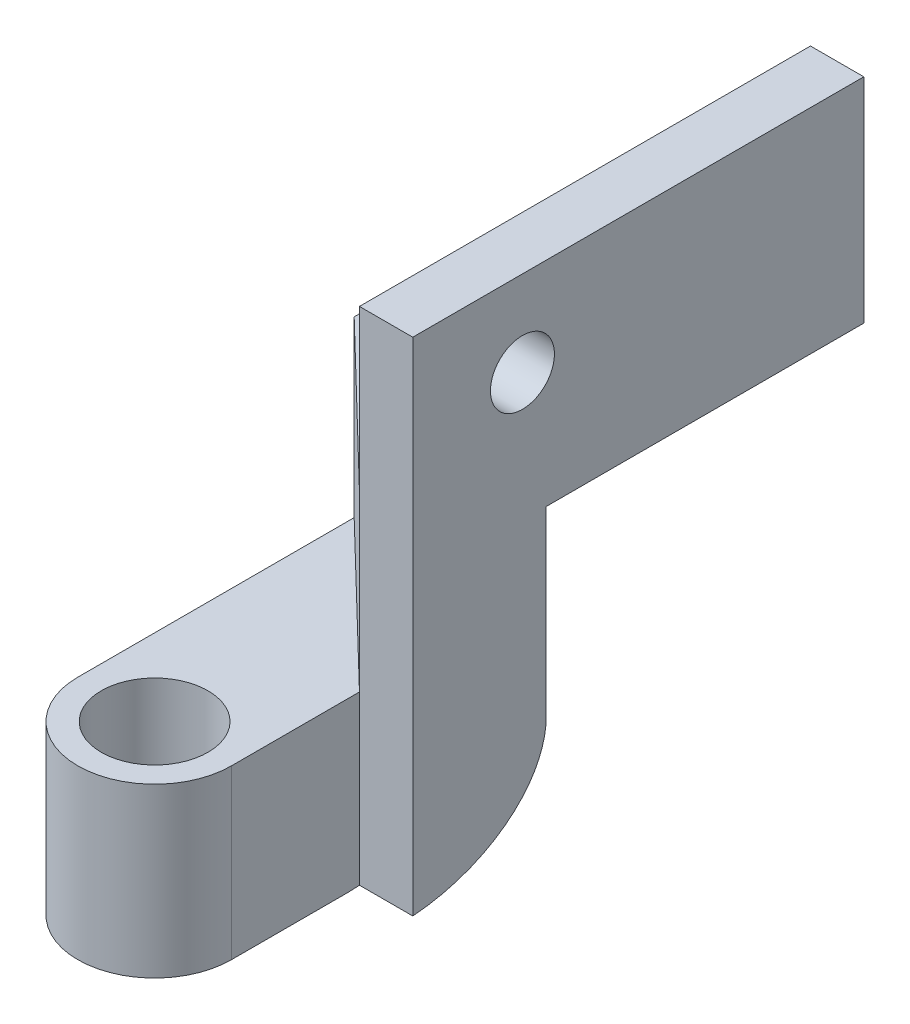
ISO-10303-21;
HEADER;
FILE_DESCRIPTION(('STEP AP214'),'2;1');
FILE_NAME('part.step','',(''),(''),'','','');
FILE_SCHEMA(('AUTOMOTIVE_DESIGN { 1 0 10303 214 1 1 1 1 }'));
ENDSEC;
DATA;
#1=APPLICATION_CONTEXT('core data for automotive mechanical design processes');
#2=APPLICATION_PROTOCOL_DEFINITION('international standard','automotive_design',2000,#1);
#3=PRODUCT_CONTEXT('',#1,'mechanical');
#4=PRODUCT('Part','Part','',(#3));
#5=PRODUCT_RELATED_PRODUCT_CATEGORY('part','',(#4));
#6=PRODUCT_DEFINITION_FORMATION('','',#4);
#7=PRODUCT_DEFINITION_CONTEXT('part definition',#1,'design');
#8=PRODUCT_DEFINITION('design','',#6,#7);
#9=PRODUCT_DEFINITION_SHAPE('','',#8);
#10=(LENGTH_UNIT() NAMED_UNIT(*) SI_UNIT(.MILLI.,.METRE.));
#11=(NAMED_UNIT(*) PLANE_ANGLE_UNIT() SI_UNIT($,.RADIAN.));
#12=(NAMED_UNIT(*) SI_UNIT($,.STERADIAN.) SOLID_ANGLE_UNIT());
#13=UNCERTAINTY_MEASURE_WITH_UNIT(LENGTH_MEASURE(1.E-05),#10,'distance_accuracy_value','');
#14=(GEOMETRIC_REPRESENTATION_CONTEXT(3) GLOBAL_UNCERTAINTY_ASSIGNED_CONTEXT((#13)) GLOBAL_UNIT_ASSIGNED_CONTEXT((#10,
#11,#12)) REPRESENTATION_CONTEXT('',''));
#15=CARTESIAN_POINT('',(0.,0.,0.));
#16=DIRECTION('',(0.,0.,1.));
#17=DIRECTION('',(1.,0.,0.));
#18=AXIS2_PLACEMENT_3D('',#15,#16,#17);
#19=CARTESIAN_POINT('',(3.59999999999999,-2.5,0.));
#20=DIRECTION('',(1.,0.,0.));
#21=DIRECTION('',(0.,0.,-1.));
#22=AXIS2_PLACEMENT_3D('',#19,#20,#21);
#23=PLANE('',#22);
#24=DIRECTION('',(0.,-1.,0.));
#25=VECTOR('',#24,1.);
#26=CARTESIAN_POINT('',(3.60000000000002,0.,-6.));
#27=LINE('',#26,#25);
#28=CARTESIAN_POINT('',(3.59999999999999,-8.15,-6.));
#29=VERTEX_POINT('',#28);
#30=CARTESIAN_POINT('',(3.60000000000002,-15.9949371855331,-6.));
#31=VERTEX_POINT('',#30);
#32=EDGE_CURVE('E163',#29,#31,#27,.T.);
#33=ORIENTED_EDGE('',*,*,#32,.F.);
#34=DIRECTION('',(0.,0.,-1.));
#35=VECTOR('',#34,1.);
#36=CARTESIAN_POINT('',(3.59999999999999,-8.15,0.));
#37=LINE('',#36,#35);
#38=CARTESIAN_POINT('',(3.59999999999999,-8.15,0.));
#39=VERTEX_POINT('',#38);
#40=EDGE_CURVE('E183',#39,#29,#37,.T.);
#41=ORIENTED_EDGE('',*,*,#40,.F.);
#42=DIRECTION('',(0.,1.,0.));
#43=VECTOR('',#42,1.);
#44=CARTESIAN_POINT('',(3.59999999999999,-16.02,0.));
#45=LINE('',#44,#43);
#46=CARTESIAN_POINT('',(3.59999999999999,-16.02,0.));
#47=VERTEX_POINT('',#46);
#48=EDGE_CURVE('E186',#47,#39,#45,.T.);
#49=ORIENTED_EDGE('',*,*,#48,.F.);
#50=DIRECTION('',(0.,0.,1.));
#51=VECTOR('',#50,1.);
#52=CARTESIAN_POINT('',(3.59999999999999,-16.02,0.));
#53=LINE('',#52,#51);
#54=CARTESIAN_POINT('',(3.59999999999999,-16.02,-5.30491820449167));
#55=VERTEX_POINT('',#54);
#56=EDGE_CURVE('E194',#55,#47,#53,.T.);
#57=ORIENTED_EDGE('',*,*,#56,.F.);
#58=CARTESIAN_POINT('',(3.59999999999999,-11.02,-5.30491820449167));
#59=DIRECTION('',(1.,0.,0.));
#60=DIRECTION('',(0.,0.,-1.));
#61=AXIS2_PLACEMENT_3D('',#58,#59,#60);
#62=ELLIPSE('',#61,6.95081795508336,5.);
#63=EDGE_CURVE('E11',#55,#31,#62,.T.);
#64=ORIENTED_EDGE('',*,*,#63,.T.);
#65=EDGE_LOOP('',(#33,#41,#49,#57,#64));
#66=FACE_BOUND('',#65,.T.);
#67=ADVANCED_FACE('F41',(#66),#23,.T.);
#68=CARTESIAN_POINT('',(4.73535338699276,-2.5,-4.9036019787419));
#69=DIRECTION('',(-0.694658370458993,0.,0.719339800338655));
#70=DIRECTION('',(0.719339800338655,0.,0.694658370458993));
#71=AXIS2_PLACEMENT_3D('',#68,#69,#70);
#72=PLANE('',#71);
#73=DIRECTION('',(0.,1.,0.));
#74=VECTOR('',#73,1.);
#75=CARTESIAN_POINT('',(-3.59999999999999,-2.5,-12.9529591786108));
#76=LINE('',#75,#74);
#77=CARTESIAN_POINT('',(-3.59999999999999,-8.15,-12.9529591786108));
#78=VERTEX_POINT('',#77);
#79=CARTESIAN_POINT('',(-3.59999999999999,0.,-12.9529591786108));
#80=VERTEX_POINT('',#79);
#81=EDGE_CURVE('E215',#78,#80,#76,.T.);
#82=ORIENTED_EDGE('',*,*,#81,.F.);
#83=DIRECTION('',(0.719339800338655,0.,0.694658370458993));
#84=VECTOR('',#83,1.);
#85=CARTESIAN_POINT('',(4.73535338699276,-8.15,-4.9036019787419));
#86=LINE('',#85,#84);
#87=EDGE_CURVE('E174',#78,#29,#86,.T.);
#88=ORIENTED_EDGE('',*,*,#87,.T.);
#89=DIRECTION('',(0.,1.,0.));
#90=VECTOR('',#89,1.);
#91=CARTESIAN_POINT('',(3.59999999999999,-2.5,-6.));
#92=LINE('',#91,#90);
#93=CARTESIAN_POINT('',(3.59999999999999,0.,-6.));
#94=VERTEX_POINT('',#93);
#95=EDGE_CURVE('E226',#29,#94,#92,.T.);
#96=ORIENTED_EDGE('',*,*,#95,.T.);
#97=DIRECTION('',(0.719339800338655,0.,0.694658370458993));
#98=VECTOR('',#97,1.);
#99=CARTESIAN_POINT('',(4.73535338699276,0.,-4.9036019787419));
#100=LINE('',#99,#98);
#101=EDGE_CURVE('E217',#80,#94,#100,.T.);
#102=ORIENTED_EDGE('',*,*,#101,.F.);
#103=EDGE_LOOP('',(#82,#88,#96,#102));
#104=FACE_BOUND('',#103,.T.);
#105=ADVANCED_FACE('F307',(#104),#72,.T.);
#106=CARTESIAN_POINT('',(0.,-2.5,0.));
#107=DIRECTION('',(0.,1.,0.));
#108=DIRECTION('',(0.,0.,1.));
#109=AXIS2_PLACEMENT_3D('',#106,#107,#108);
#110=PLANE('',#109);
#111=CARTESIAN_POINT('',(-0.400000000000008,-2.5,-21.14));
#112=DIRECTION('',(0.,1.,0.));
#113=DIRECTION('',(0.,0.,1.));
#114=AXIS2_PLACEMENT_3D('',#111,#112,#113);
#115=CIRCLE('',#114,1.5);
#116=CARTESIAN_POINT('',(-0.400000000000008,-2.5,-19.64));
#117=VERTEX_POINT('',#116);
#118=EDGE_CURVE('E205',#117,#117,#115,.T.);
#119=ORIENTED_EDGE('',*,*,#118,.T.);
#120=EDGE_LOOP('',(#119));
#121=FACE_BOUND('',#120,.T.);
#122=DIRECTION('',(0.719339800338655,0.,0.694658370458993));
#123=VECTOR('',#122,1.);
#124=CARTESIAN_POINT('',(7.86131605405823,-2.5,-8.14063108026585));
#125=LINE('',#124,#123);
#126=CARTESIAN_POINT('',(-3.59999999999999,-2.5,-19.2086953381859));
#127=VERTEX_POINT('',#126);
#128=CARTESIAN_POINT('',(3.59999999999999,-2.5,-12.255736159575));
#129=VERTEX_POINT('',#128);
#130=EDGE_CURVE('E227',#127,#129,#125,.T.);
#131=ORIENTED_EDGE('',*,*,#130,.F.);
#132=DIRECTION('',(0.,0.,1.));
#133=VECTOR('',#132,1.);
#134=CARTESIAN_POINT('',(-3.59999999999999,-2.5,0.));
#135=LINE('',#134,#133);
#136=CARTESIAN_POINT('',(-3.6,-2.5,-27.14));
#137=VERTEX_POINT('',#136);
#138=EDGE_CURVE('E204',#137,#127,#135,.T.);
#139=ORIENTED_EDGE('',*,*,#138,.F.);
#140=DIRECTION('',(-1.,0.,0.));
#141=VECTOR('',#140,1.);
#142=CARTESIAN_POINT('',(0.,-2.5,-27.14));
#143=LINE('',#142,#141);
#144=CARTESIAN_POINT('',(6.10000000000014,-2.5,-27.14));
#145=VERTEX_POINT('',#144);
#146=EDGE_CURVE('E209',#145,#137,#143,.T.);
#147=ORIENTED_EDGE('',*,*,#146,.F.);
#148=DIRECTION('',(0.,0.,-1.));
#149=VECTOR('',#148,1.);
#150=CARTESIAN_POINT('',(6.09999999999999,-2.5,0.));
#151=LINE('',#150,#149);
#152=CARTESIAN_POINT('',(6.10000000000006,-2.5,-12.255736159575));
#153=VERTEX_POINT('',#152);
#154=EDGE_CURVE('E260',#153,#145,#151,.T.);
#155=ORIENTED_EDGE('',*,*,#154,.F.);
#156=DIRECTION('',(-1.,0.,0.));
#157=VECTOR('',#156,1.);
#158=CARTESIAN_POINT('',(6.10000000000006,-2.5,-12.255736159575));
#159=LINE('',#158,#157);
#160=EDGE_CURVE('E170',#153,#129,#159,.T.);
#161=ORIENTED_EDGE('',*,*,#160,.T.);
#162=EDGE_LOOP('',(#131,#139,#147,#155,#161));
#163=FACE_BOUND('',#162,.T.);
#164=ADVANCED_FACE('F244',(#121,#163),#110,.F.);
#165=CARTESIAN_POINT('',(-3.59999999999999,-2.5,0.));
#166=DIRECTION('',(-1.,0.,0.));
#167=DIRECTION('',(0.,0.,1.));
#168=AXIS2_PLACEMENT_3D('',#165,#166,#167);
#169=PLANE('',#168);
#170=DIRECTION('',(0.,1.,0.));
#171=VECTOR('',#170,1.);
#172=CARTESIAN_POINT('',(-3.59999999999999,-31.0635910784963,-19.2086953381859));
#173=LINE('',#172,#171);
#174=CARTESIAN_POINT('',(-3.59999999999999,-11.02,-19.2086953381859));
#175=VERTEX_POINT('',#174);
#176=EDGE_CURVE('E192',#175,#127,#173,.T.);
#177=ORIENTED_EDGE('',*,*,#176,.F.);
#178=CARTESIAN_POINT('',(-3.59999999999999,-11.02,-12.2578773831025));
#179=DIRECTION('',(-1.,0.,0.));
#180=DIRECTION('',(0.,0.,-1.));
#181=AXIS2_PLACEMENT_3D('',#178,#179,#180);
#182=ELLIPSE('',#181,6.95081795508336,5.);
#183=CARTESIAN_POINT('',(-3.59999999999999,-16.02,-12.2578773831025));
#184=VERTEX_POINT('',#183);
#185=EDGE_CURVE('E64',#175,#184,#182,.T.);
#186=ORIENTED_EDGE('',*,*,#185,.T.);
#187=DIRECTION('',(0.,0.,-1.));
#188=VECTOR('',#187,1.);
#189=CARTESIAN_POINT('',(-3.59999999999999,-16.02,0.));
#190=LINE('',#189,#188);
#191=CARTESIAN_POINT('',(-3.59999999999999,-16.02,0.));
#192=VERTEX_POINT('',#191);
#193=EDGE_CURVE('E193',#192,#184,#190,.T.);
#194=ORIENTED_EDGE('',*,*,#193,.F.);
#195=DIRECTION('',(0.,1.,0.));
#196=VECTOR('',#195,1.);
#197=CARTESIAN_POINT('',(-3.59999999999999,-16.02,0.));
#198=LINE('',#197,#196);
#199=CARTESIAN_POINT('',(-3.59999999999999,-8.15,0.));
#200=VERTEX_POINT('',#199);
#201=EDGE_CURVE('E180',#192,#200,#198,.T.);
#202=ORIENTED_EDGE('',*,*,#201,.T.);
#203=DIRECTION('',(0.,0.,1.));
#204=VECTOR('',#203,1.);
#205=CARTESIAN_POINT('',(-3.59999999999999,-8.15,0.));
#206=LINE('',#205,#204);
#207=EDGE_CURVE('E164',#78,#200,#206,.T.);
#208=ORIENTED_EDGE('',*,*,#207,.F.);
#209=ORIENTED_EDGE('',*,*,#81,.T.);
#210=DIRECTION('',(0.,0.,1.));
#211=VECTOR('',#210,1.);
#212=CARTESIAN_POINT('',(-3.59999999999999,0.,0.));
#213=LINE('',#212,#211);
#214=CARTESIAN_POINT('',(-3.6,0.,-27.14));
#215=VERTEX_POINT('',#214);
#216=EDGE_CURVE('E213',#215,#80,#213,.T.);
#217=ORIENTED_EDGE('',*,*,#216,.F.);
#218=DIRECTION('',(0.,1.,0.));
#219=VECTOR('',#218,1.);
#220=CARTESIAN_POINT('',(-3.6,-2.5,-27.14));
#221=LINE('',#220,#219);
#222=EDGE_CURVE('E224',#137,#215,#221,.T.);
#223=ORIENTED_EDGE('',*,*,#222,.F.);
#224=ORIENTED_EDGE('',*,*,#138,.T.);
#225=EDGE_LOOP('',(#177,#186,#194,#202,#208,#209,#217,#223,#224));
#226=FACE_BOUND('',#225,.T.);
#227=ADVANCED_FACE('F241',(#226),#169,.T.);
#228=CARTESIAN_POINT('',(0.,-2.5,-27.14));
#229=DIRECTION('',(0.,0.,-1.));
#230=DIRECTION('',(-1.,0.,0.));
#231=AXIS2_PLACEMENT_3D('',#228,#229,#230);
#232=PLANE('',#231);
#233=DIRECTION('',(-1.,0.,0.));
#234=VECTOR('',#233,1.);
#235=CARTESIAN_POINT('',(0.,0.,-27.14));
#236=LINE('',#235,#234);
#237=CARTESIAN_POINT('',(3.59999999999999,0.,-27.14));
#238=VERTEX_POINT('',#237);
#239=EDGE_CURVE('E207',#238,#215,#236,.T.);
#240=ORIENTED_EDGE('',*,*,#239,.F.);
#241=DIRECTION('',(0.,1.,0.));
#242=VECTOR('',#241,1.);
#243=CARTESIAN_POINT('',(3.60000000000014,0.,-27.14));
#244=LINE('',#243,#242);
#245=CARTESIAN_POINT('',(3.60000000000014,7.5,-27.14));
#246=VERTEX_POINT('',#245);
#247=EDGE_CURVE('E272',#238,#246,#244,.T.);
#248=ORIENTED_EDGE('',*,*,#247,.T.);
#249=DIRECTION('',(-1.,0.,0.));
#250=VECTOR('',#249,1.);
#251=CARTESIAN_POINT('',(6.10000000000014,7.5,-27.14));
#252=LINE('',#251,#250);
#253=CARTESIAN_POINT('',(6.10000000000014,7.5,-27.14));
#254=VERTEX_POINT('',#253);
#255=EDGE_CURVE('E257',#254,#246,#252,.T.);
#256=ORIENTED_EDGE('',*,*,#255,.F.);
#257=DIRECTION('',(0.,1.,0.));
#258=VECTOR('',#257,1.);
#259=CARTESIAN_POINT('',(6.10000000000014,0.,-27.14));
#260=LINE('',#259,#258);
#261=EDGE_CURVE('E251',#145,#254,#260,.T.);
#262=ORIENTED_EDGE('',*,*,#261,.F.);
#263=ORIENTED_EDGE('',*,*,#146,.T.);
#264=ORIENTED_EDGE('',*,*,#222,.T.);
#265=EDGE_LOOP('',(#240,#248,#256,#262,#263,#264));
#266=FACE_BOUND('',#265,.T.);
#267=ADVANCED_FACE('F255',(#266),#232,.T.);
#268=CARTESIAN_POINT('',(-0.400000000000008,-2.5,-21.14));
#269=DIRECTION('',(0.,1.,0.));
#270=DIRECTION('',(0.,0.,1.));
#271=AXIS2_PLACEMENT_3D('',#268,#269,#270);
#272=CYLINDRICAL_SURFACE('',#271,1.5);
#273=ORIENTED_EDGE('',*,*,#118,.F.);
#274=EDGE_LOOP('',(#273));
#275=FACE_BOUND('',#274,.T.);
#276=CARTESIAN_POINT('',(-0.400000000000008,0.,-21.14));
#277=DIRECTION('',(0.,1.,0.));
#278=DIRECTION('',(0.,0.,1.));
#279=AXIS2_PLACEMENT_3D('',#276,#277,#278);
#280=CIRCLE('',#279,1.5);
#281=CARTESIAN_POINT('',(-0.400000000000008,0.,-19.64));
#282=VERTEX_POINT('',#281);
#283=EDGE_CURVE('E203',#282,#282,#280,.T.);
#284=ORIENTED_EDGE('',*,*,#283,.T.);
#285=EDGE_LOOP('',(#284));
#286=FACE_BOUND('',#285,.T.);
#287=ADVANCED_FACE('F312',(#275,#286),#272,.F.);
#288=CARTESIAN_POINT('',(0.,0.,0.));
#289=DIRECTION('',(0.,1.,0.));
#290=DIRECTION('',(0.,0.,1.));
#291=AXIS2_PLACEMENT_3D('',#288,#289,#290);
#292=PLANE('',#291);
#293=DIRECTION('',(0.,0.,-1.));
#294=VECTOR('',#293,1.);
#295=CARTESIAN_POINT('',(3.59999999999999,0.,0.));
#296=LINE('',#295,#294);
#297=EDGE_CURVE('E223',#94,#238,#296,.T.);
#298=ORIENTED_EDGE('',*,*,#297,.T.);
#299=ORIENTED_EDGE('',*,*,#239,.T.);
#300=ORIENTED_EDGE('',*,*,#216,.T.);
#301=ORIENTED_EDGE('',*,*,#101,.T.);
#302=EDGE_LOOP('',(#298,#299,#300,#301));
#303=FACE_BOUND('',#302,.T.);
#304=ORIENTED_EDGE('',*,*,#283,.F.);
#305=EDGE_LOOP('',(#304));
#306=FACE_BOUND('',#305,.T.);
#307=ADVANCED_FACE('F306',(#303,#306),#292,.T.);
#308=CARTESIAN_POINT('',(7.86131605405823,-31.0635910784963,-8.14063108026585));
#309=DIRECTION('',(-0.694658370458993,0.,0.719339800338655));
#310=DIRECTION('',(0.719339800338655,0.,0.694658370458993));
#311=AXIS2_PLACEMENT_3D('',#308,#309,#310);
#312=PLANE('',#311);
#313=DIRECTION('',(0.,1.,0.));
#314=VECTOR('',#313,1.);
#315=CARTESIAN_POINT('',(3.59999999999999,-31.0635910784963,-12.255736159575));
#316=LINE('',#315,#314);
#317=CARTESIAN_POINT('',(3.59999999999999,-11.02,-12.255736159575));
#318=VERTEX_POINT('',#317);
#319=EDGE_CURVE('E196',#318,#129,#316,.T.);
#320=ORIENTED_EDGE('',*,*,#319,.F.);
#321=DIRECTION('',(-0.719339800338655,0.,-0.694658370458993));
#322=VECTOR('',#321,1.);
#323=CARTESIAN_POINT('',(7.86131605405823,-11.02,-8.14063108026585));
#324=LINE('',#323,#322);
#325=EDGE_CURVE('E235',#318,#175,#324,.T.);
#326=ORIENTED_EDGE('',*,*,#325,.T.);
#327=ORIENTED_EDGE('',*,*,#176,.T.);
#328=ORIENTED_EDGE('',*,*,#130,.T.);
#329=EDGE_LOOP('',(#320,#326,#327,#328));
#330=FACE_BOUND('',#329,.T.);
#331=ADVANCED_FACE('F240',(#330),#312,.F.);
#332=CARTESIAN_POINT('',(0.,-16.02,0.));
#333=DIRECTION('',(0.,1.,0.));
#334=DIRECTION('',(0.,0.,1.));
#335=AXIS2_PLACEMENT_3D('',#332,#333,#334);
#336=PLANE('',#335);
#337=ORIENTED_EDGE('',*,*,#193,.T.);
#338=DIRECTION('',(-0.719339800338655,0.,-0.694658370458993));
#339=VECTOR('',#338,1.);
#340=CARTESIAN_POINT('',(4.38802420176326,-16.02,-4.54393207857258));
#341=LINE('',#340,#339);
#342=EDGE_CURVE('E47',#184,#55,#341,.F.);
#343=ORIENTED_EDGE('',*,*,#342,.T.);
#344=ORIENTED_EDGE('',*,*,#56,.T.);
#345=CARTESIAN_POINT('',(0.,-16.02,0.));
#346=DIRECTION('',(0.,1.,0.));
#347=DIRECTION('',(0.,0.,1.));
#348=AXIS2_PLACEMENT_3D('',#345,#346,#347);
#349=CIRCLE('',#348,3.59999999999999);
#350=EDGE_CURVE('E172',#192,#47,#349,.T.);
#351=ORIENTED_EDGE('',*,*,#350,.F.);
#352=EDGE_LOOP('',(#337,#343,#344,#351));
#353=FACE_BOUND('',#352,.T.);
#354=CARTESIAN_POINT('',(0.,-16.02,0.));
#355=DIRECTION('',(0.,1.,0.));
#356=DIRECTION('',(0.,0.,1.));
#357=AXIS2_PLACEMENT_3D('',#354,#355,#356);
#358=CIRCLE('',#357,2.5);
#359=CARTESIAN_POINT('',(0.,-16.02,2.5));
#360=VERTEX_POINT('',#359);
#361=EDGE_CURVE('E171',#360,#360,#358,.T.);
#362=ORIENTED_EDGE('',*,*,#361,.T.);
#363=EDGE_LOOP('',(#362));
#364=FACE_BOUND('',#363,.T.);
#365=ADVANCED_FACE('F297',(#353,#364),#336,.F.);
#366=CARTESIAN_POINT('',(0.,-16.02,0.));
#367=DIRECTION('',(0.,1.,0.));
#368=DIRECTION('',(0.,0.,1.));
#369=AXIS2_PLACEMENT_3D('',#366,#367,#368);
#370=CYLINDRICAL_SURFACE('',#369,2.5);
#371=ORIENTED_EDGE('',*,*,#361,.F.);
#372=EDGE_LOOP('',(#371));
#373=FACE_BOUND('',#372,.T.);
#374=CARTESIAN_POINT('',(0.,-8.15,0.));
#375=DIRECTION('',(0.,1.,0.));
#376=DIRECTION('',(0.,0.,1.));
#377=AXIS2_PLACEMENT_3D('',#374,#375,#376);
#378=CIRCLE('',#377,2.5);
#379=CARTESIAN_POINT('',(0.,-8.15,2.5));
#380=VERTEX_POINT('',#379);
#381=EDGE_CURVE('E162',#380,#380,#378,.T.);
#382=ORIENTED_EDGE('',*,*,#381,.T.);
#383=EDGE_LOOP('',(#382));
#384=FACE_BOUND('',#383,.T.);
#385=ADVANCED_FACE('F298',(#373,#384),#370,.F.);
#386=CARTESIAN_POINT('',(0.,-16.02,0.));
#387=DIRECTION('',(0.,1.,0.));
#388=DIRECTION('',(0.,0.,1.));
#389=AXIS2_PLACEMENT_3D('',#386,#387,#388);
#390=CYLINDRICAL_SURFACE('',#389,3.59999999999999);
#391=CARTESIAN_POINT('',(0.,-8.15,0.));
#392=DIRECTION('',(0.,1.,0.));
#393=DIRECTION('',(0.,0.,1.));
#394=AXIS2_PLACEMENT_3D('',#391,#392,#393);
#395=CIRCLE('',#394,3.59999999999999);
#396=EDGE_CURVE('E181',#200,#39,#395,.T.);
#397=ORIENTED_EDGE('',*,*,#396,.F.);
#398=ORIENTED_EDGE('',*,*,#201,.F.);
#399=ORIENTED_EDGE('',*,*,#350,.T.);
#400=ORIENTED_EDGE('',*,*,#48,.T.);
#401=EDGE_LOOP('',(#397,#398,#399,#400));
#402=FACE_BOUND('',#401,.T.);
#403=ADVANCED_FACE('F292',(#402),#390,.T.);
#404=CARTESIAN_POINT('',(0.,-8.15,0.));
#405=DIRECTION('',(0.,1.,0.));
#406=DIRECTION('',(0.,0.,1.));
#407=AXIS2_PLACEMENT_3D('',#404,#405,#406);
#408=PLANE('',#407);
#409=ORIENTED_EDGE('',*,*,#381,.F.);
#410=EDGE_LOOP('',(#409));
#411=FACE_BOUND('',#410,.T.);
#412=ORIENTED_EDGE('',*,*,#207,.T.);
#413=ORIENTED_EDGE('',*,*,#396,.T.);
#414=ORIENTED_EDGE('',*,*,#40,.T.);
#415=ORIENTED_EDGE('',*,*,#87,.F.);
#416=EDGE_LOOP('',(#412,#413,#414,#415));
#417=FACE_BOUND('',#416,.T.);
#418=ADVANCED_FACE('F287',(#411,#417),#408,.T.);
#419=CARTESIAN_POINT('',(4.38802420176326,-11.02,-4.54393207857258));
#420=DIRECTION('',(-0.719339800338655,0.,-0.694658370458993));
#421=DIRECTION('',(-0.694658370458993,0.,0.719339800338655));
#422=AXIS2_PLACEMENT_3D('',#419,#420,#421);
#423=CYLINDRICAL_SURFACE('',#422,5.);
#424=ORIENTED_EDGE('',*,*,#63,.F.);
#425=ORIENTED_EDGE('',*,*,#342,.F.);
#426=ORIENTED_EDGE('',*,*,#185,.F.);
#427=ORIENTED_EDGE('',*,*,#325,.F.);
#428=CARTESIAN_POINT('',(3.60000000000002,-11.02,-5.30491820449167));
#429=DIRECTION('',(1.,0.,0.));
#430=DIRECTION('',(0.,0.,-1.));
#431=AXIS2_PLACEMENT_3D('',#428,#429,#430);
#432=ELLIPSE('',#431,6.95081795508336,5.);
#433=EDGE_CURVE('E267',#31,#318,#432,.T.);
#434=ORIENTED_EDGE('',*,*,#433,.F.);
#435=EDGE_LOOP('',(#424,#425,#426,#427,#434));
#436=FACE_BOUND('',#435,.T.);
#437=ADVANCED_FACE('F43',(#436),#423,.T.);
#438=CARTESIAN_POINT('',(6.10000000000002,0.,-5.99999999999999));
#439=DIRECTION('',(0.,0.,-1.));
#440=DIRECTION('',(-1.,0.,0.));
#441=AXIS2_PLACEMENT_3D('',#438,#439,#440);
#442=PLANE('',#441);
#443=CARTESIAN_POINT('',(3.60000000000002,7.5,-5.99999999999999));
#444=VERTEX_POINT('',#443);
#445=EDGE_CURVE('E270',#444,#94,#27,.T.);
#446=ORIENTED_EDGE('',*,*,#445,.T.);
#447=ORIENTED_EDGE('',*,*,#95,.F.);
#448=ORIENTED_EDGE('',*,*,#32,.T.);
#449=DIRECTION('',(-1.,0.,0.));
#450=VECTOR('',#449,1.);
#451=CARTESIAN_POINT('',(6.10000000000002,-15.9949371855331,-5.99999999999999));
#452=LINE('',#451,#450);
#453=CARTESIAN_POINT('',(6.10000000000002,-15.9949371855331,-5.99999999999999));
#454=VERTEX_POINT('',#453);
#455=EDGE_CURVE('E137',#454,#31,#452,.T.);
#456=ORIENTED_EDGE('',*,*,#455,.F.);
#457=DIRECTION('',(0.,-1.,0.));
#458=VECTOR('',#457,1.);
#459=CARTESIAN_POINT('',(6.10000000000002,0.,-5.99999999999999));
#460=LINE('',#459,#458);
#461=CARTESIAN_POINT('',(6.10000000000002,7.5,-5.99999999999998));
#462=VERTEX_POINT('',#461);
#463=EDGE_CURVE('E143',#462,#454,#460,.T.);
#464=ORIENTED_EDGE('',*,*,#463,.F.);
#465=DIRECTION('',(-1.,0.,0.));
#466=VECTOR('',#465,1.);
#467=CARTESIAN_POINT('',(6.10000000000002,7.5,-5.99999999999998));
#468=LINE('',#467,#466);
#469=EDGE_CURVE('E268',#462,#444,#468,.T.);
#470=ORIENTED_EDGE('',*,*,#469,.T.);
#471=EDGE_LOOP('',(#446,#447,#448,#456,#464,#470));
#472=FACE_BOUND('',#471,.T.);
#473=ADVANCED_FACE('F157',(#472),#442,.F.);
#474=CARTESIAN_POINT('',(6.10000000000002,-11.02,-5.30491820449165));
#475=DIRECTION('',(1.,0.,0.));
#476=DIRECTION('',(0.,0.,-1.));
#477=AXIS2_PLACEMENT_3D('',#474,#475,#476);
#478=ELLIPSE('',#477,6.95081795508336,5.);
#479=DIRECTION('',(-1.,0.,0.));
#480=VECTOR('',#479,1.);
#481=SURFACE_OF_LINEAR_EXTRUSION('',#478,#480);
#482=ORIENTED_EDGE('',*,*,#433,.T.);
#483=DIRECTION('',(-1.,0.,0.));
#484=VECTOR('',#483,1.);
#485=CARTESIAN_POINT('',(6.10000000000006,-11.02,-12.255736159575));
#486=LINE('',#485,#484);
#487=CARTESIAN_POINT('',(6.10000000000006,-11.02,-12.255736159575));
#488=VERTEX_POINT('',#487);
#489=EDGE_CURVE('E142',#488,#318,#486,.T.);
#490=ORIENTED_EDGE('',*,*,#489,.F.);
#491=EDGE_CURVE('E133',#454,#488,#478,.T.);
#492=ORIENTED_EDGE('',*,*,#491,.F.);
#493=ORIENTED_EDGE('',*,*,#455,.T.);
#494=EDGE_LOOP('',(#482,#490,#492,#493));
#495=FACE_BOUND('',#494,.T.);
#496=ADVANCED_FACE('F140',(#495),#481,.F.);
#497=CARTESIAN_POINT('',(6.10000000000006,0.,-12.255736159575));
#498=DIRECTION('',(0.,0.,1.));
#499=DIRECTION('',(1.,0.,0.));
#500=AXIS2_PLACEMENT_3D('',#497,#498,#499);
#501=PLANE('',#500);
#502=ORIENTED_EDGE('',*,*,#319,.T.);
#503=ORIENTED_EDGE('',*,*,#160,.F.);
#504=DIRECTION('',(0.,1.,0.));
#505=VECTOR('',#504,1.);
#506=CARTESIAN_POINT('',(6.10000000000006,0.,-12.255736159575));
#507=LINE('',#506,#505);
#508=EDGE_CURVE('E144',#488,#153,#507,.T.);
#509=ORIENTED_EDGE('',*,*,#508,.F.);
#510=ORIENTED_EDGE('',*,*,#489,.T.);
#511=EDGE_LOOP('',(#502,#503,#509,#510));
#512=FACE_BOUND('',#511,.T.);
#513=ADVANCED_FACE('F278',(#512),#501,.F.);
#514=CARTESIAN_POINT('',(6.09999999999999,7.5,0.));
#515=DIRECTION('',(0.,-1.,0.));
#516=DIRECTION('',(0.,0.,-1.));
#517=AXIS2_PLACEMENT_3D('',#514,#515,#516);
#518=PLANE('',#517);
#519=DIRECTION('',(0.,0.,1.));
#520=VECTOR('',#519,1.);
#521=CARTESIAN_POINT('',(3.59999999999999,7.5,0.));
#522=LINE('',#521,#520);
#523=EDGE_CURVE('E271',#246,#444,#522,.T.);
#524=ORIENTED_EDGE('',*,*,#523,.T.);
#525=ORIENTED_EDGE('',*,*,#469,.F.);
#526=DIRECTION('',(0.,0.,1.));
#527=VECTOR('',#526,1.);
#528=CARTESIAN_POINT('',(6.09999999999999,7.5,0.));
#529=LINE('',#528,#527);
#530=EDGE_CURVE('E151',#254,#462,#529,.T.);
#531=ORIENTED_EDGE('',*,*,#530,.F.);
#532=ORIENTED_EDGE('',*,*,#255,.T.);
#533=EDGE_LOOP('',(#524,#525,#531,#532));
#534=FACE_BOUND('',#533,.T.);
#535=ADVANCED_FACE('F412',(#534),#518,.F.);
#536=CARTESIAN_POINT('',(6.10000000000005,3.5,-11.14));
#537=DIRECTION('',(-1.,0.,0.));
#538=DIRECTION('',(0.,0.,1.));
#539=AXIS2_PLACEMENT_3D('',#536,#537,#538);
#540=CYLINDRICAL_SURFACE('',#539,1.5);
#541=CARTESIAN_POINT('',(6.10000000000005,3.5,-11.14));
#542=DIRECTION('',(1.,0.,0.));
#543=DIRECTION('',(0.,0.,-1.));
#544=AXIS2_PLACEMENT_3D('',#541,#542,#543);
#545=CIRCLE('',#544,1.5);
#546=CARTESIAN_POINT('',(6.10000000000006,3.5,-12.64));
#547=VERTEX_POINT('',#546);
#548=EDGE_CURVE('E256',#547,#547,#545,.T.);
#549=ORIENTED_EDGE('',*,*,#548,.T.);
#550=EDGE_LOOP('',(#549));
#551=FACE_BOUND('',#550,.T.);
#552=CARTESIAN_POINT('',(3.60000000000005,3.5,-11.14));
#553=DIRECTION('',(1.,0.,0.));
#554=DIRECTION('',(0.,0.,-1.));
#555=AXIS2_PLACEMENT_3D('',#552,#553,#554);
#556=CIRCLE('',#555,1.5);
#557=CARTESIAN_POINT('',(3.60000000000006,3.5,-12.64));
#558=VERTEX_POINT('',#557);
#559=EDGE_CURVE('E154',#558,#558,#556,.T.);
#560=ORIENTED_EDGE('',*,*,#559,.F.);
#561=EDGE_LOOP('',(#560));
#562=FACE_BOUND('',#561,.T.);
#563=ADVANCED_FACE('F417',(#551,#562),#540,.F.);
#564=CARTESIAN_POINT('',(6.09999999999999,0.,0.));
#565=DIRECTION('',(1.,0.,0.));
#566=DIRECTION('',(0.,0.,-1.));
#567=AXIS2_PLACEMENT_3D('',#564,#565,#566);
#568=PLANE('',#567);
#569=ORIENTED_EDGE('',*,*,#463,.T.);
#570=ORIENTED_EDGE('',*,*,#491,.T.);
#571=ORIENTED_EDGE('',*,*,#508,.T.);
#572=ORIENTED_EDGE('',*,*,#154,.T.);
#573=ORIENTED_EDGE('',*,*,#261,.T.);
#574=ORIENTED_EDGE('',*,*,#530,.T.);
#575=EDGE_LOOP('',(#569,#570,#571,#572,#573,#574));
#576=FACE_BOUND('',#575,.T.);
#577=ORIENTED_EDGE('',*,*,#548,.F.);
#578=EDGE_LOOP('',(#577));
#579=FACE_BOUND('',#578,.T.);
#580=ADVANCED_FACE('F149',(#576,#579),#568,.T.);
#581=CARTESIAN_POINT('',(3.59999999999999,0.,0.));
#582=DIRECTION('',(1.,0.,0.));
#583=DIRECTION('',(0.,0.,-1.));
#584=AXIS2_PLACEMENT_3D('',#581,#582,#583);
#585=PLANE('',#584);
#586=ORIENTED_EDGE('',*,*,#297,.F.);
#587=ORIENTED_EDGE('',*,*,#445,.F.);
#588=ORIENTED_EDGE('',*,*,#523,.F.);
#589=ORIENTED_EDGE('',*,*,#247,.F.);
#590=EDGE_LOOP('',(#586,#587,#588,#589));
#591=FACE_BOUND('',#590,.T.);
#592=ORIENTED_EDGE('',*,*,#559,.T.);
#593=EDGE_LOOP('',(#592));
#594=FACE_BOUND('',#593,.T.);
#595=ADVANCED_FACE('F436',(#591,#594),#585,.F.);
#596=CLOSED_SHELL('',(#67,#105,#164,#227,#267,#287,#307,#331,#365,#385,#403,#418,#437,#473,#496,
#513,#535,#563,#580,#595));
#597=MANIFOLD_SOLID_BREP('B2',#596);
#598=ADVANCED_BREP_SHAPE_REPRESENTATION('',(#18,#597),#14);
#599=SHAPE_DEFINITION_REPRESENTATION(#9,#598);
ENDSEC;
END-ISO-10303-21;
